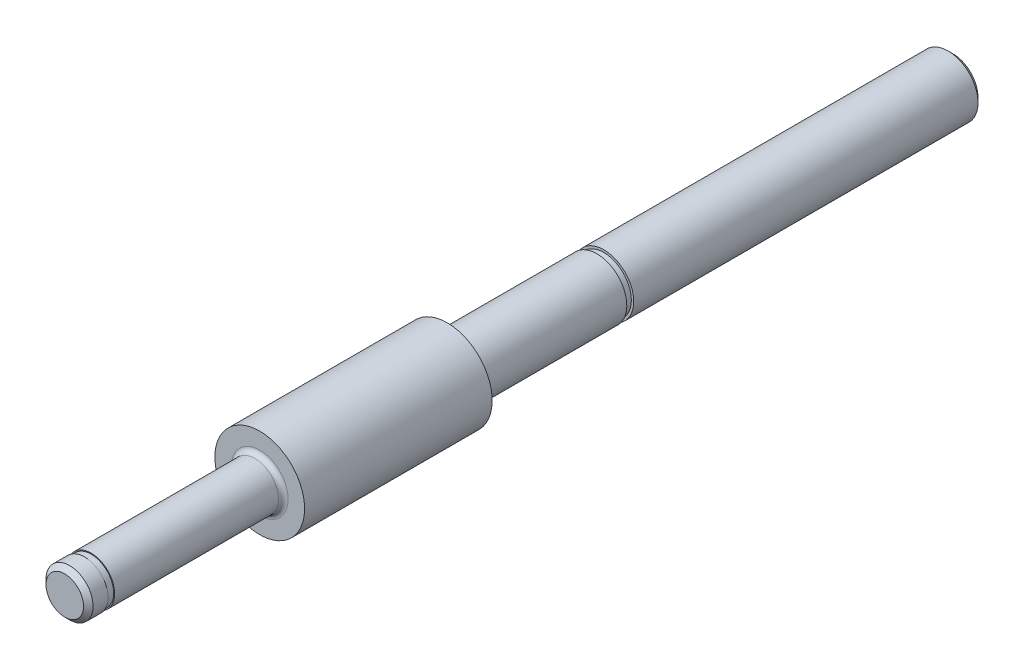
ISO-10303-21;
HEADER;
FILE_DESCRIPTION(('STEP AP214'),'2;1');
FILE_NAME('part.step','',(''),(''),'','','');
FILE_SCHEMA(('AUTOMOTIVE_DESIGN { 1 0 10303 214 1 1 1 1 }'));
ENDSEC;
DATA;
#1=APPLICATION_CONTEXT('core data for automotive mechanical design processes');
#2=APPLICATION_PROTOCOL_DEFINITION('international standard','automotive_design',2000,#1);
#3=PRODUCT_CONTEXT('',#1,'mechanical');
#4=PRODUCT('Part','Part','',(#3));
#5=PRODUCT_RELATED_PRODUCT_CATEGORY('part','',(#4));
#6=PRODUCT_DEFINITION_FORMATION('','',#4);
#7=PRODUCT_DEFINITION_CONTEXT('part definition',#1,'design');
#8=PRODUCT_DEFINITION('design','',#6,#7);
#9=PRODUCT_DEFINITION_SHAPE('','',#8);
#10=(LENGTH_UNIT() NAMED_UNIT(*) SI_UNIT(.MILLI.,.METRE.));
#11=(NAMED_UNIT(*) PLANE_ANGLE_UNIT() SI_UNIT($,.RADIAN.));
#12=(NAMED_UNIT(*) SI_UNIT($,.STERADIAN.) SOLID_ANGLE_UNIT());
#13=UNCERTAINTY_MEASURE_WITH_UNIT(LENGTH_MEASURE(1.E-05),#10,'distance_accuracy_value','');
#14=(GEOMETRIC_REPRESENTATION_CONTEXT(3) GLOBAL_UNCERTAINTY_ASSIGNED_CONTEXT((#13)) GLOBAL_UNIT_ASSIGNED_CONTEXT((#10,
#11,#12)) REPRESENTATION_CONTEXT('',''));
#15=CARTESIAN_POINT('',(0.,0.,0.));
#16=DIRECTION('',(0.,0.,1.));
#17=DIRECTION('',(1.,0.,0.));
#18=AXIS2_PLACEMENT_3D('',#15,#16,#17);
#19=CARTESIAN_POINT('',(0.,4.7625,31.1579113568709));
#20=DIRECTION('',(0.,0.,-1.));
#21=DIRECTION('',(0.,1.,0.));
#22=AXIS2_PLACEMENT_3D('',#19,#20,#21);
#23=PLANE('',#22);
#24=CARTESIAN_POINT('',(0.,0.,31.1579113568709));
#25=DIRECTION('',(0.,0.,-1.));
#26=DIRECTION('',(0.,1.,0.));
#27=AXIS2_PLACEMENT_3D('',#24,#25,#26);
#28=CIRCLE('',#27,3.683);
#29=CARTESIAN_POINT('',(0.,3.683,31.1579113568709));
#30=VERTEX_POINT('',#29);
#31=EDGE_CURVE('E46',#30,#30,#28,.F.);
#32=ORIENTED_EDGE('',*,*,#31,.T.);
#33=EDGE_LOOP('',(#32));
#34=FACE_BOUND('',#33,.T.);
#35=CARTESIAN_POINT('',(0.,0.,31.1579113568709));
#36=DIRECTION('',(0.,0.,-1.));
#37=DIRECTION('',(0.,1.,0.));
#38=AXIS2_PLACEMENT_3D('',#35,#36,#37);
#39=CIRCLE('',#38,4.7625);
#40=CARTESIAN_POINT('',(0.,4.7625,31.1579113568709));
#41=VERTEX_POINT('',#40);
#42=EDGE_CURVE('E61',#41,#41,#39,.T.);
#43=ORIENTED_EDGE('',*,*,#42,.T.);
#44=EDGE_LOOP('',(#43));
#45=FACE_BOUND('',#44,.T.);
#46=ADVANCED_FACE('F35',(#34,#45),#23,.T.);
#47=CARTESIAN_POINT('',(0.,0.,0.));
#48=DIRECTION('',(0.,0.,-1.));
#49=DIRECTION('',(0.,1.,0.));
#50=AXIS2_PLACEMENT_3D('',#47,#48,#49);
#51=CYLINDRICAL_SURFACE('',#50,4.7625);
#52=CARTESIAN_POINT('',(0.,0.,51.0686784083247));
#53=DIRECTION('',(0.,0.,-1.));
#54=DIRECTION('',(0.,1.,0.));
#55=AXIS2_PLACEMENT_3D('',#52,#53,#54);
#56=CIRCLE('',#55,4.7625);
#57=CARTESIAN_POINT('',(0.,4.76249999999999,51.0686784083247));
#58=VERTEX_POINT('',#57);
#59=EDGE_CURVE('E64',#58,#58,#56,.T.);
#60=ORIENTED_EDGE('',*,*,#59,.T.);
#61=EDGE_LOOP('',(#60));
#62=FACE_BOUND('',#61,.T.);
#63=ORIENTED_EDGE('',*,*,#42,.F.);
#64=EDGE_LOOP('',(#63));
#65=FACE_BOUND('',#64,.T.);
#66=ADVANCED_FACE('F116',(#62,#65),#51,.T.);
#67=CARTESIAN_POINT('',(0.,2.49999999999999,51.0686784083247));
#68=DIRECTION('',(0.,0.,1.));
#69=DIRECTION('',(0.,-1.,0.));
#70=AXIS2_PLACEMENT_3D('',#67,#68,#69);
#71=PLANE('',#70);
#72=CARTESIAN_POINT('',(0.,0.,51.0686784083247));
#73=DIRECTION('',(0.,0.,1.));
#74=DIRECTION('',(0.,-1.,0.));
#75=AXIS2_PLACEMENT_3D('',#72,#73,#74);
#76=CIRCLE('',#75,3.008);
#77=CARTESIAN_POINT('',(0.,-3.00800000000001,51.0686784083247));
#78=VERTEX_POINT('',#77);
#79=EDGE_CURVE('E42',#78,#78,#76,.F.);
#80=ORIENTED_EDGE('',*,*,#79,.T.);
#81=EDGE_LOOP('',(#80));
#82=FACE_BOUND('',#81,.T.);
#83=ORIENTED_EDGE('',*,*,#59,.F.);
#84=EDGE_LOOP('',(#83));
#85=FACE_BOUND('',#84,.T.);
#86=ADVANCED_FACE('F122',(#82,#85),#71,.T.);
#87=CARTESIAN_POINT('',(0.,0.,0.));
#88=DIRECTION('',(0.,0.,-1.));
#89=DIRECTION('',(0.,1.,0.));
#90=AXIS2_PLACEMENT_3D('',#87,#88,#89);
#91=CYLINDRICAL_SURFACE('',#90,2.5);
#92=CARTESIAN_POINT('',(0.,0.,51.5766784083247));
#93=DIRECTION('',(0.,0.,1.));
#94=DIRECTION('',(0.,-1.,0.));
#95=AXIS2_PLACEMENT_3D('',#92,#93,#94);
#96=CIRCLE('',#95,2.5);
#97=CARTESIAN_POINT('',(0.,-2.50000000000001,51.5766784083247));
#98=VERTEX_POINT('',#97);
#99=EDGE_CURVE('E10',#98,#98,#96,.T.);
#100=ORIENTED_EDGE('',*,*,#99,.T.);
#101=EDGE_LOOP('',(#100));
#102=FACE_BOUND('',#101,.T.);
#103=CARTESIAN_POINT('',(0.,0.,68.9686782843546));
#104=DIRECTION('',(0.,0.,-1.));
#105=DIRECTION('',(0.,1.,0.));
#106=AXIS2_PLACEMENT_3D('',#103,#104,#105);
#107=CIRCLE('',#106,2.5);
#108=CARTESIAN_POINT('',(0.,2.49999999999999,68.9686782843546));
#109=VERTEX_POINT('',#108);
#110=EDGE_CURVE('E67',#109,#109,#107,.T.);
#111=ORIENTED_EDGE('',*,*,#110,.T.);
#112=EDGE_LOOP('',(#111));
#113=FACE_BOUND('',#112,.T.);
#114=ADVANCED_FACE('F157',(#102,#113),#91,.T.);
#115=CARTESIAN_POINT('',(0.,2.49999999999999,68.9686782843546));
#116=DIRECTION('',(0.,0.,1.));
#117=DIRECTION('',(0.,-1.,0.));
#118=AXIS2_PLACEMENT_3D('',#115,#116,#117);
#119=PLANE('',#118);
#120=CARTESIAN_POINT('',(0.,0.,68.9686782843546));
#121=DIRECTION('',(0.,0.,-1.));
#122=DIRECTION('',(0.,1.,0.));
#123=AXIS2_PLACEMENT_3D('',#120,#121,#122);
#124=CIRCLE('',#123,2.4);
#125=CARTESIAN_POINT('',(0.,2.39999999999999,68.9686782843546));
#126=VERTEX_POINT('',#125);
#127=EDGE_CURVE('E70',#126,#126,#124,.T.);
#128=ORIENTED_EDGE('',*,*,#127,.T.);
#129=EDGE_LOOP('',(#128));
#130=FACE_BOUND('',#129,.T.);
#131=ORIENTED_EDGE('',*,*,#110,.F.);
#132=EDGE_LOOP('',(#131));
#133=FACE_BOUND('',#132,.T.);
#134=ADVANCED_FACE('F162',(#130,#133),#119,.T.);
#135=CARTESIAN_POINT('',(0.,0.,0.));
#136=DIRECTION('',(0.,0.,-1.));
#137=DIRECTION('',(0.,1.,0.));
#138=AXIS2_PLACEMENT_3D('',#135,#136,#137);
#139=CYLINDRICAL_SURFACE('',#138,2.4);
#140=CARTESIAN_POINT('',(0.,0.,69.6686784083546));
#141=DIRECTION('',(0.,0.,-1.));
#142=DIRECTION('',(0.,1.,0.));
#143=AXIS2_PLACEMENT_3D('',#140,#141,#142);
#144=CIRCLE('',#143,2.4);
#145=CARTESIAN_POINT('',(0.,2.39999999999999,69.6686784083546));
#146=VERTEX_POINT('',#145);
#147=EDGE_CURVE('E73',#146,#146,#144,.T.);
#148=ORIENTED_EDGE('',*,*,#147,.T.);
#149=EDGE_LOOP('',(#148));
#150=FACE_BOUND('',#149,.T.);
#151=ORIENTED_EDGE('',*,*,#127,.F.);
#152=EDGE_LOOP('',(#151));
#153=FACE_BOUND('',#152,.T.);
#154=ADVANCED_FACE('F265',(#150,#153),#139,.T.);
#155=CARTESIAN_POINT('',(0.,2.49999999999999,69.6686784083546));
#156=DIRECTION('',(0.,0.,-1.));
#157=DIRECTION('',(0.,1.,0.));
#158=AXIS2_PLACEMENT_3D('',#155,#156,#157);
#159=PLANE('',#158);
#160=CARTESIAN_POINT('',(0.,0.,69.6686784083546));
#161=DIRECTION('',(0.,0.,-1.));
#162=DIRECTION('',(0.,1.,0.));
#163=AXIS2_PLACEMENT_3D('',#160,#161,#162);
#164=CIRCLE('',#163,2.5);
#165=CARTESIAN_POINT('',(0.,2.49999999999999,69.6686784083546));
#166=VERTEX_POINT('',#165);
#167=EDGE_CURVE('E76',#166,#166,#164,.T.);
#168=ORIENTED_EDGE('',*,*,#167,.T.);
#169=EDGE_LOOP('',(#168));
#170=FACE_BOUND('',#169,.T.);
#171=ORIENTED_EDGE('',*,*,#147,.F.);
#172=EDGE_LOOP('',(#171));
#173=FACE_BOUND('',#172,.T.);
#174=ADVANCED_FACE('F255',(#170,#173),#159,.T.);
#175=CARTESIAN_POINT('',(0.,0.,0.));
#176=DIRECTION('',(0.,0.,-1.));
#177=DIRECTION('',(0.,1.,0.));
#178=AXIS2_PLACEMENT_3D('',#175,#176,#177);
#179=CYLINDRICAL_SURFACE('',#178,2.5);
#180=CARTESIAN_POINT('',(0.,0.,71.258540521135));
#181=DIRECTION('',(0.,0.,-1.));
#182=DIRECTION('',(0.,1.,0.));
#183=AXIS2_PLACEMENT_3D('',#180,#181,#182);
#184=CIRCLE('',#183,2.5);
#185=CARTESIAN_POINT('',(0.,2.49999999999999,71.258540521135));
#186=VERTEX_POINT('',#185);
#187=EDGE_CURVE('E79',#186,#186,#184,.T.);
#188=ORIENTED_EDGE('',*,*,#187,.T.);
#189=EDGE_LOOP('',(#188));
#190=FACE_BOUND('',#189,.T.);
#191=ORIENTED_EDGE('',*,*,#167,.F.);
#192=EDGE_LOOP('',(#191));
#193=FACE_BOUND('',#192,.T.);
#194=ADVANCED_FACE('F245',(#190,#193),#179,.T.);
#195=CARTESIAN_POINT('',(0.,0.,71.258540521135));
#196=DIRECTION('',(0.,0.,-1.));
#197=DIRECTION('',(0.,1.,0.));
#198=AXIS2_PLACEMENT_3D('',#195,#196,#197);
#199=CONICAL_SURFACE('',#198,2.5,0.785398163397453);
#200=CARTESIAN_POINT('',(0.,0.,71.766540521135));
#201=DIRECTION('',(0.,0.,-1.));
#202=DIRECTION('',(0.,1.,0.));
#203=AXIS2_PLACEMENT_3D('',#200,#201,#202);
#204=CIRCLE('',#203,1.992);
#205=CARTESIAN_POINT('',(0.,1.99199999999999,71.766540521135));
#206=VERTEX_POINT('',#205);
#207=EDGE_CURVE('E82',#206,#206,#204,.T.);
#208=ORIENTED_EDGE('',*,*,#207,.T.);
#209=EDGE_LOOP('',(#208));
#210=FACE_BOUND('',#209,.T.);
#211=ORIENTED_EDGE('',*,*,#187,.F.);
#212=EDGE_LOOP('',(#211));
#213=FACE_BOUND('',#212,.T.);
#214=ADVANCED_FACE('F235',(#210,#213),#199,.T.);
#215=CARTESIAN_POINT('',(0.,0.,71.766540521135));
#216=DIRECTION('',(0.,0.,1.));
#217=DIRECTION('',(0.,-1.,0.));
#218=AXIS2_PLACEMENT_3D('',#215,#216,#217);
#219=PLANE('',#218);
#220=ORIENTED_EDGE('',*,*,#207,.F.);
#221=EDGE_LOOP('',(#220));
#222=FACE_BOUND('',#221,.T.);
#223=ADVANCED_FACE('F204',(#222),#219,.T.);
#224=CARTESIAN_POINT('',(0.,3.175,-22.5081733788366));
#225=DIRECTION('',(0.,0.,-1.));
#226=DIRECTION('',(0.,1.,0.));
#227=AXIS2_PLACEMENT_3D('',#224,#225,#226);
#228=PLANE('',#227);
#229=CARTESIAN_POINT('',(0.,0.,-22.5081733788366));
#230=DIRECTION('',(0.,0.,-1.));
#231=DIRECTION('',(0.,1.,0.));
#232=AXIS2_PLACEMENT_3D('',#229,#230,#231);
#233=CIRCLE('',#232,2.66699999999999);
#234=CARTESIAN_POINT('',(0.,2.66699999999999,-22.5081733788366));
#235=VERTEX_POINT('',#234);
#236=EDGE_CURVE('E58',#235,#235,#233,.T.);
#237=ORIENTED_EDGE('',*,*,#236,.T.);
#238=EDGE_LOOP('',(#237));
#239=FACE_BOUND('',#238,.T.);
#240=ADVANCED_FACE('F192',(#239),#228,.T.);
#241=CARTESIAN_POINT('',(0.,0.,0.));
#242=DIRECTION('',(0.,0.,-1.));
#243=DIRECTION('',(0.,1.,0.));
#244=AXIS2_PLACEMENT_3D('',#241,#242,#243);
#245=CYLINDRICAL_SURFACE('',#244,3.175);
#246=CARTESIAN_POINT('',(0.,0.,-22.0001733788366));
#247=DIRECTION('',(0.,0.,-1.));
#248=DIRECTION('',(0.,1.,0.));
#249=AXIS2_PLACEMENT_3D('',#246,#247,#248);
#250=CIRCLE('',#249,3.175);
#251=CARTESIAN_POINT('',(0.,3.175,-22.0001733788366));
#252=VERTEX_POINT('',#251);
#253=EDGE_CURVE('E55',#252,#252,#250,.F.);
#254=ORIENTED_EDGE('',*,*,#253,.T.);
#255=EDGE_LOOP('',(#254));
#256=FACE_BOUND('',#255,.T.);
#257=CARTESIAN_POINT('',(0.,0.,14.5453085221521));
#258=DIRECTION('',(0.,0.,-1.));
#259=DIRECTION('',(0.,1.,0.));
#260=AXIS2_PLACEMENT_3D('',#257,#258,#259);
#261=CIRCLE('',#260,3.175);
#262=CARTESIAN_POINT('',(0.,3.175,14.5453085221521));
#263=VERTEX_POINT('',#262);
#264=EDGE_CURVE('E85',#263,#263,#261,.T.);
#265=ORIENTED_EDGE('',*,*,#264,.T.);
#266=EDGE_LOOP('',(#265));
#267=FACE_BOUND('',#266,.T.);
#268=ADVANCED_FACE('F186',(#256,#267),#245,.T.);
#269=CARTESIAN_POINT('',(0.,3.175,14.5453085221521));
#270=DIRECTION('',(0.,0.,1.));
#271=DIRECTION('',(0.,-1.,0.));
#272=AXIS2_PLACEMENT_3D('',#269,#270,#271);
#273=PLANE('',#272);
#274=CARTESIAN_POINT('',(0.,0.,14.5453085221521));
#275=DIRECTION('',(0.,0.,-1.));
#276=DIRECTION('',(0.,1.,0.));
#277=AXIS2_PLACEMENT_3D('',#274,#275,#276);
#278=CIRCLE('',#277,2.921);
#279=CARTESIAN_POINT('',(0.,2.921,14.5453085221521));
#280=VERTEX_POINT('',#279);
#281=EDGE_CURVE('E88',#280,#280,#278,.T.);
#282=ORIENTED_EDGE('',*,*,#281,.T.);
#283=EDGE_LOOP('',(#282));
#284=FACE_BOUND('',#283,.T.);
#285=ORIENTED_EDGE('',*,*,#264,.F.);
#286=EDGE_LOOP('',(#285));
#287=FACE_BOUND('',#286,.T.);
#288=ADVANCED_FACE('F191',(#284,#287),#273,.T.);
#289=CARTESIAN_POINT('',(0.,0.,0.));
#290=DIRECTION('',(0.,0.,-1.));
#291=DIRECTION('',(0.,1.,0.));
#292=AXIS2_PLACEMENT_3D('',#289,#290,#291);
#293=CYLINDRICAL_SURFACE('',#292,2.921);
#294=CARTESIAN_POINT('',(0.,0.,15.2819085221521));
#295=DIRECTION('',(0.,0.,-1.));
#296=DIRECTION('',(0.,1.,0.));
#297=AXIS2_PLACEMENT_3D('',#294,#295,#296);
#298=CIRCLE('',#297,2.921);
#299=CARTESIAN_POINT('',(0.,2.921,15.2819085221521));
#300=VERTEX_POINT('',#299);
#301=EDGE_CURVE('E91',#300,#300,#298,.T.);
#302=ORIENTED_EDGE('',*,*,#301,.T.);
#303=EDGE_LOOP('',(#302));
#304=FACE_BOUND('',#303,.T.);
#305=ORIENTED_EDGE('',*,*,#281,.F.);
#306=EDGE_LOOP('',(#305));
#307=FACE_BOUND('',#306,.T.);
#308=ADVANCED_FACE('F113',(#304,#307),#293,.T.);
#309=CARTESIAN_POINT('',(0.,3.175,15.2819085221521));
#310=DIRECTION('',(0.,0.,-1.));
#311=DIRECTION('',(0.,1.,0.));
#312=AXIS2_PLACEMENT_3D('',#309,#310,#311);
#313=PLANE('',#312);
#314=CARTESIAN_POINT('',(0.,0.,15.2819085221521));
#315=DIRECTION('',(0.,0.,-1.));
#316=DIRECTION('',(0.,1.,0.));
#317=AXIS2_PLACEMENT_3D('',#314,#315,#316);
#318=CIRCLE('',#317,3.175);
#319=CARTESIAN_POINT('',(0.,3.175,15.2819085221521));
#320=VERTEX_POINT('',#319);
#321=EDGE_CURVE('E94',#320,#320,#318,.T.);
#322=ORIENTED_EDGE('',*,*,#321,.T.);
#323=EDGE_LOOP('',(#322));
#324=FACE_BOUND('',#323,.T.);
#325=ORIENTED_EDGE('',*,*,#301,.F.);
#326=EDGE_LOOP('',(#325));
#327=FACE_BOUND('',#326,.T.);
#328=ADVANCED_FACE('F98',(#324,#327),#313,.T.);
#329=CARTESIAN_POINT('',(0.,0.,0.));
#330=DIRECTION('',(0.,0.,-1.));
#331=DIRECTION('',(0.,1.,0.));
#332=AXIS2_PLACEMENT_3D('',#329,#330,#331);
#333=CYLINDRICAL_SURFACE('',#332,3.175);
#334=CARTESIAN_POINT('',(0.,0.,30.6499113568709));
#335=DIRECTION('',(0.,0.,-1.));
#336=DIRECTION('',(0.,1.,0.));
#337=AXIS2_PLACEMENT_3D('',#334,#335,#336);
#338=CIRCLE('',#337,3.175);
#339=CARTESIAN_POINT('',(0.,3.175,30.6499113568709));
#340=VERTEX_POINT('',#339);
#341=EDGE_CURVE('E50',#340,#340,#338,.T.);
#342=ORIENTED_EDGE('',*,*,#341,.T.);
#343=EDGE_LOOP('',(#342));
#344=FACE_BOUND('',#343,.T.);
#345=ORIENTED_EDGE('',*,*,#321,.F.);
#346=EDGE_LOOP('',(#345));
#347=FACE_BOUND('',#346,.T.);
#348=ADVANCED_FACE('F101',(#344,#347),#333,.T.);
#349=CARTESIAN_POINT('',(0.,0.,-22.5081733788366));
#350=DIRECTION('',(0.,0.,1.));
#351=DIRECTION('',(0.,-1.,0.));
#352=AXIS2_PLACEMENT_3D('',#349,#350,#351);
#353=CONICAL_SURFACE('',#352,2.66699999999999,0.785398163397451);
#354=ORIENTED_EDGE('',*,*,#253,.F.);
#355=EDGE_LOOP('',(#354));
#356=FACE_BOUND('',#355,.T.);
#357=ORIENTED_EDGE('',*,*,#236,.F.);
#358=EDGE_LOOP('',(#357));
#359=FACE_BOUND('',#358,.T.);
#360=ADVANCED_FACE('F103',(#356,#359),#353,.T.);
#361=CARTESIAN_POINT('',(0.,0.,30.6499113568709));
#362=DIRECTION('',(0.,0.,-1.));
#363=DIRECTION('',(0.,1.,0.));
#364=AXIS2_PLACEMENT_3D('',#361,#362,#363);
#365=TOROIDAL_SURFACE('',#364,3.683,0.508);
#366=ORIENTED_EDGE('',*,*,#31,.F.);
#367=EDGE_LOOP('',(#366));
#368=FACE_BOUND('',#367,.T.);
#369=ORIENTED_EDGE('',*,*,#341,.F.);
#370=EDGE_LOOP('',(#369));
#371=FACE_BOUND('',#370,.T.);
#372=ADVANCED_FACE('F110',(#368,#371),#365,.F.);
#373=CARTESIAN_POINT('',(0.,0.,51.5766784083247));
#374=DIRECTION('',(0.,0.,1.));
#375=DIRECTION('',(0.,-1.,0.));
#376=AXIS2_PLACEMENT_3D('',#373,#374,#375);
#377=TOROIDAL_SURFACE('',#376,3.008,0.508);
#378=ORIENTED_EDGE('',*,*,#99,.F.);
#379=EDGE_LOOP('',(#378));
#380=FACE_BOUND('',#379,.T.);
#381=ORIENTED_EDGE('',*,*,#79,.F.);
#382=EDGE_LOOP('',(#381));
#383=FACE_BOUND('',#382,.T.);
#384=ADVANCED_FACE('F37',(#380,#383),#377,.F.);
#385=CLOSED_SHELL('',(#46,#66,#86,#114,#134,#154,#174,#194,#214,#223,#240,#268,#288,#308,#328,
#348,#360,#372,#384));
#386=MANIFOLD_SOLID_BREP('B2',#385);
#387=ADVANCED_BREP_SHAPE_REPRESENTATION('',(#18,#386),#14);
#388=SHAPE_DEFINITION_REPRESENTATION(#9,#387);
ENDSEC;
END-ISO-10303-21;
